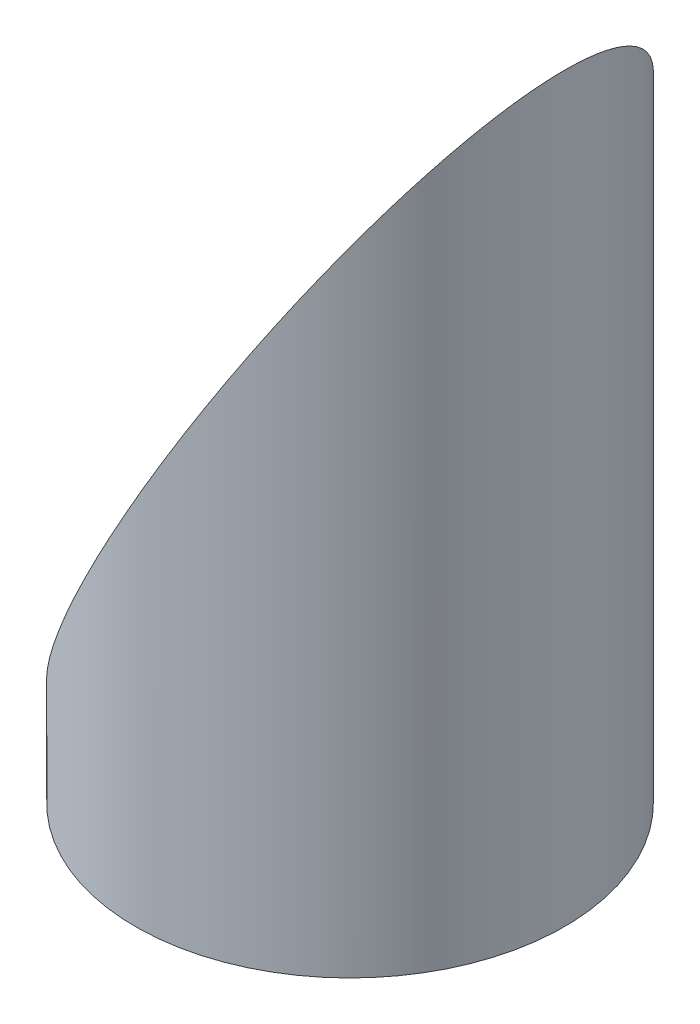
ISO-10303-21;
HEADER;
FILE_DESCRIPTION(('STEP AP214'),'2;1');
FILE_NAME('part.step','',(''),(''),'','','');
FILE_SCHEMA(('AUTOMOTIVE_DESIGN { 1 0 10303 214 1 1 1 1 }'));
ENDSEC;
DATA;
#1=APPLICATION_CONTEXT('core data for automotive mechanical design processes');
#2=APPLICATION_PROTOCOL_DEFINITION('international standard','automotive_design',2000,#1);
#3=PRODUCT_CONTEXT('',#1,'mechanical');
#4=PRODUCT('Part','Part','',(#3));
#5=PRODUCT_RELATED_PRODUCT_CATEGORY('part','',(#4));
#6=PRODUCT_DEFINITION_FORMATION('','',#4);
#7=PRODUCT_DEFINITION_CONTEXT('part definition',#1,'design');
#8=PRODUCT_DEFINITION('design','',#6,#7);
#9=PRODUCT_DEFINITION_SHAPE('','',#8);
#10=(LENGTH_UNIT() NAMED_UNIT(*) SI_UNIT(.MILLI.,.METRE.));
#11=(NAMED_UNIT(*) PLANE_ANGLE_UNIT() SI_UNIT($,.RADIAN.));
#12=(NAMED_UNIT(*) SI_UNIT($,.STERADIAN.) SOLID_ANGLE_UNIT());
#13=UNCERTAINTY_MEASURE_WITH_UNIT(LENGTH_MEASURE(1.E-05),#10,'distance_accuracy_value','');
#14=(GEOMETRIC_REPRESENTATION_CONTEXT(3) GLOBAL_UNCERTAINTY_ASSIGNED_CONTEXT((#13)) GLOBAL_UNIT_ASSIGNED_CONTEXT((#10,
#11,#12)) REPRESENTATION_CONTEXT('',''));
#15=CARTESIAN_POINT('',(0.,0.,0.));
#16=DIRECTION('',(0.,0.,1.));
#17=DIRECTION('',(1.,0.,0.));
#18=AXIS2_PLACEMENT_3D('',#15,#16,#17);
#19=CARTESIAN_POINT('',(-31.7704471263826,-3.26650437500902,-59.1431925782918));
#20=DIRECTION('',(0.866025403784442,-0.499999999999995,0.));
#21=DIRECTION('',(0.499999999999995,0.866025403784442,0.));
#22=AXIS2_PLACEMENT_3D('',#19,#20,#21);
#23=PLANE('',#22);
#24=CARTESIAN_POINT('',(0.,51.7615242270671,0.));
#25=DIRECTION('',(0.866025403784442,-0.499999999999995,0.));
#26=DIRECTION('',(-0.499999999999995,-0.866025403784442,0.));
#27=AXIS2_PLACEMENT_3D('',#24,#25,#26);
#28=ELLIPSE('',#27,54.0000000000005,27.);
#29=CARTESIAN_POINT('',(-27.,4.99615242270674,0.));
#30=VERTEX_POINT('',#29);
#31=EDGE_CURVE('E11',#30,#30,#28,.T.);
#32=ORIENTED_EDGE('',*,*,#31,.T.);
#33=EDGE_LOOP('',(#32));
#34=FACE_BOUND('',#33,.T.);
#35=DIRECTION('',(0.,0.,-1.));
#36=VECTOR('',#35,1.);
#37=CARTESIAN_POINT('',(-29.8845299461621,0.,0.));
#38=LINE('',#37,#36);
#39=CARTESIAN_POINT('',(-29.8845299461621,0.,2.62961402052487));
#40=VERTEX_POINT('',#39);
#41=CARTESIAN_POINT('',(-29.8845299461621,0.,-2.62961402052487));
#42=VERTEX_POINT('',#41);
#43=EDGE_CURVE('E54',#40,#42,#38,.T.);
#44=ORIENTED_EDGE('',*,*,#43,.F.);
#45=CARTESIAN_POINT('',(0.,51.7615242270671,0.));
#46=DIRECTION('',(0.866025403784442,-0.499999999999995,0.));
#47=DIRECTION('',(-0.499999999999995,-0.866025403784442,0.));
#48=AXIS2_PLACEMENT_3D('',#45,#46,#47);
#49=ELLIPSE('',#48,60.0000000000006,30.);
#50=EDGE_CURVE('E50',#42,#40,#49,.T.);
#51=ORIENTED_EDGE('',*,*,#50,.F.);
#52=EDGE_LOOP('',(#44,#51));
#53=FACE_BOUND('',#52,.T.);
#54=ADVANCED_FACE('F37',(#34,#53),#23,.F.);
#55=CARTESIAN_POINT('',(0.,190.,0.));
#56=DIRECTION('',(0.,-1.,0.));
#57=DIRECTION('',(0.,0.,-1.));
#58=AXIS2_PLACEMENT_3D('',#55,#56,#57);
#59=CYLINDRICAL_SURFACE('',#58,30.);
#60=CARTESIAN_POINT('',(0.,0.,0.));
#61=DIRECTION('',(0.,1.,0.));
#62=DIRECTION('',(0.,0.,1.));
#63=AXIS2_PLACEMENT_3D('',#60,#61,#62);
#64=CIRCLE('',#63,30.);
#65=EDGE_CURVE('E44',#40,#42,#64,.T.);
#66=ORIENTED_EDGE('',*,*,#65,.T.);
#67=ORIENTED_EDGE('',*,*,#50,.T.);
#68=EDGE_LOOP('',(#66,#67));
#69=FACE_BOUND('',#68,.T.);
#70=ADVANCED_FACE('F62',(#69),#59,.T.);
#71=CARTESIAN_POINT('',(0.,0.,0.));
#72=DIRECTION('',(0.,1.,0.));
#73=DIRECTION('',(0.,0.,1.));
#74=AXIS2_PLACEMENT_3D('',#71,#72,#73);
#75=PLANE('',#74);
#76=ORIENTED_EDGE('',*,*,#65,.F.);
#77=ORIENTED_EDGE('',*,*,#43,.T.);
#78=EDGE_LOOP('',(#76,#77));
#79=FACE_BOUND('',#78,.T.);
#80=CARTESIAN_POINT('',(0.,0.,0.));
#81=DIRECTION('',(0.,1.,0.));
#82=DIRECTION('',(0.,0.,1.));
#83=AXIS2_PLACEMENT_3D('',#80,#81,#82);
#84=CIRCLE('',#83,27.);
#85=CARTESIAN_POINT('',(0.,0.,27.));
#86=VERTEX_POINT('',#85);
#87=EDGE_CURVE('E60',#86,#86,#84,.T.);
#88=ORIENTED_EDGE('',*,*,#87,.T.);
#89=EDGE_LOOP('',(#88));
#90=FACE_BOUND('',#89,.T.);
#91=ADVANCED_FACE('F58',(#79,#90),#75,.F.);
#92=CARTESIAN_POINT('',(0.,190.,0.));
#93=DIRECTION('',(0.,-1.,0.));
#94=DIRECTION('',(0.,0.,-1.));
#95=AXIS2_PLACEMENT_3D('',#92,#93,#94);
#96=CYLINDRICAL_SURFACE('',#95,27.);
#97=ORIENTED_EDGE('',*,*,#31,.F.);
#98=EDGE_LOOP('',(#97));
#99=FACE_BOUND('',#98,.T.);
#100=ORIENTED_EDGE('',*,*,#87,.F.);
#101=EDGE_LOOP('',(#100));
#102=FACE_BOUND('',#101,.T.);
#103=ADVANCED_FACE('F67',(#99,#102),#96,.F.);
#104=CLOSED_SHELL('',(#54,#70,#91,#103));
#105=MANIFOLD_SOLID_BREP('B2',#104);
#106=ADVANCED_BREP_SHAPE_REPRESENTATION('',(#18,#105),#14);
#107=SHAPE_DEFINITION_REPRESENTATION(#9,#106);
ENDSEC;
END-ISO-10303-21;
